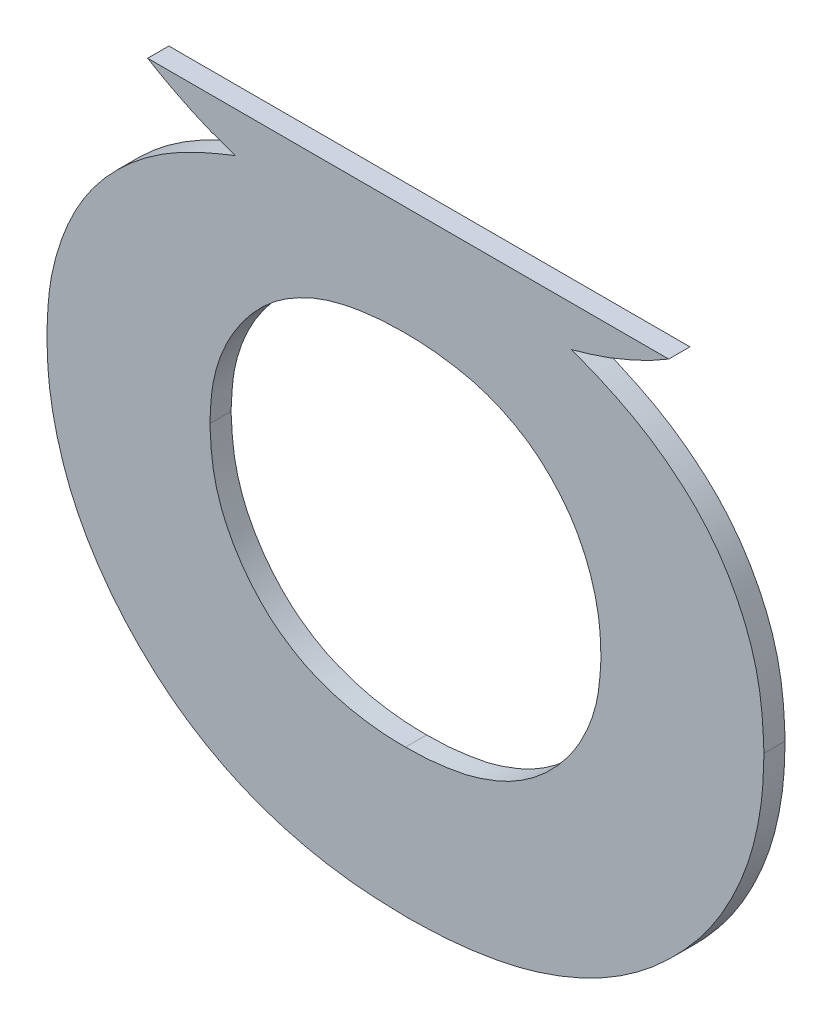
ISO-10303-21;
HEADER;
FILE_DESCRIPTION(('STEP AP214'),'2;1');
FILE_NAME('part.step','',(''),(''),'','','');
FILE_SCHEMA(('AUTOMOTIVE_DESIGN { 1 0 10303 214 1 1 1 1 }'));
ENDSEC;
DATA;
#1=APPLICATION_CONTEXT('core data for automotive mechanical design processes');
#2=APPLICATION_PROTOCOL_DEFINITION('international standard','automotive_design',2000,#1);
#3=PRODUCT_CONTEXT('',#1,'mechanical');
#4=PRODUCT('Part','Part','',(#3));
#5=PRODUCT_RELATED_PRODUCT_CATEGORY('part','',(#4));
#6=PRODUCT_DEFINITION_FORMATION('','',#4);
#7=PRODUCT_DEFINITION_CONTEXT('part definition',#1,'design');
#8=PRODUCT_DEFINITION('design','',#6,#7);
#9=PRODUCT_DEFINITION_SHAPE('','',#8);
#10=(LENGTH_UNIT() NAMED_UNIT(*) SI_UNIT(.MILLI.,.METRE.));
#11=(NAMED_UNIT(*) PLANE_ANGLE_UNIT() SI_UNIT($,.RADIAN.));
#12=(NAMED_UNIT(*) SI_UNIT($,.STERADIAN.) SOLID_ANGLE_UNIT());
#13=UNCERTAINTY_MEASURE_WITH_UNIT(LENGTH_MEASURE(1.E-05),#10,'distance_accuracy_value','');
#14=(GEOMETRIC_REPRESENTATION_CONTEXT(3) GLOBAL_UNCERTAINTY_ASSIGNED_CONTEXT((#13)) GLOBAL_UNIT_ASSIGNED_CONTEXT((#10,
#11,#12)) REPRESENTATION_CONTEXT('',''));
#15=CARTESIAN_POINT('',(0.,0.,0.));
#16=DIRECTION('',(0.,0.,1.));
#17=DIRECTION('',(1.,0.,0.));
#18=AXIS2_PLACEMENT_3D('',#15,#16,#17);
#19=CARTESIAN_POINT('',(-8.4615384615395,-7.33774038461538,0.5));
#20=CARTESIAN_POINT('',(-8.45049910584212,-7.00798334201043,0.5));
#21=CARTESIAN_POINT('',(-8.42885300590861,-6.3613918113376,0.5));
#22=CARTESIAN_POINT('',(-8.20988557211714,-5.42877117305945,0.5));
#23=CARTESIAN_POINT('',(-7.8655008079904,-4.56122101360292,0.5));
#24=CARTESIAN_POINT('',(-7.38005113331607,-3.76283143510587,0.5));
#25=CARTESIAN_POINT('',(-6.7427479601573,-3.04891273766611,0.5));
#26=CARTESIAN_POINT('',(-5.97257549572589,-2.41080431461783,0.5));
#27=CARTESIAN_POINT('',(-5.0490386410386,-1.8736283607361,0.5));
#28=CARTESIAN_POINT('',(-4.36890273799675,-1.59798785054026,0.5));
#29=CARTESIAN_POINT('',(-4.01442307692411,-1.45432692307692,0.5));
#30=B_SPLINE_CURVE_WITH_KNOTS('',3,(#19,#20,#21,#22,#23,#24,#25,#26,#27,#28,#29),.UNSPECIFIED.,
.F.,.F.,(4,1,1,1,1,1,1,1,4),(0.,0.124810317489397,0.24472955480108,0.360917336242945,
0.477471766605826,0.596906810690356,0.722033177176971,0.855126622924826,1.),.UNSPECIFIED.);
#31=DIRECTION('',(0.,0.,1.));
#32=VECTOR('',#31,1.);
#33=SURFACE_OF_LINEAR_EXTRUSION('',#30,#32);
#34=CARTESIAN_POINT('',(-8.4615384615395,-7.33774038461538,1.));
#35=CARTESIAN_POINT('',(-8.45049910584212,-7.00798334201043,1.));
#36=CARTESIAN_POINT('',(-8.42885300590861,-6.3613918113376,1.));
#37=CARTESIAN_POINT('',(-8.20988557211714,-5.42877117305945,1.));
#38=CARTESIAN_POINT('',(-7.8655008079904,-4.56122101360292,1.));
#39=CARTESIAN_POINT('',(-7.38005113331607,-3.76283143510587,1.));
#40=CARTESIAN_POINT('',(-6.7427479601573,-3.04891273766611,1.));
#41=CARTESIAN_POINT('',(-5.97257549572589,-2.41080431461783,1.));
#42=CARTESIAN_POINT('',(-5.0490386410386,-1.8736283607361,1.));
#43=CARTESIAN_POINT('',(-4.36890273799675,-1.59798785054026,1.));
#44=CARTESIAN_POINT('',(-4.01442307692411,-1.45432692307692,1.));
#45=B_SPLINE_CURVE_WITH_KNOTS('',3,(#34,#35,#36,#37,#38,#39,#40,#41,#42,#43,#44),.UNSPECIFIED.,
.F.,.F.,(4,1,1,1,1,1,1,1,4),(0.,0.124810317489397,0.24472955480108,0.360917336242945,
0.477471766605826,0.596906810690356,0.722033177176971,0.855126622924826,1.),.UNSPECIFIED.);
#46=CARTESIAN_POINT('',(-8.46153846153949,-7.33774038461538,1.));
#47=VERTEX_POINT('',#46);
#48=CARTESIAN_POINT('',(-4.01442307692411,-1.45432692307692,1.));
#49=VERTEX_POINT('',#48);
#50=EDGE_CURVE('E172',#47,#49,#45,.T.);
#51=ORIENTED_EDGE('',*,*,#50,.T.);
#52=DIRECTION('',(0.,0.,1.));
#53=VECTOR('',#52,1.);
#54=CARTESIAN_POINT('',(-4.01442307692411,-1.45432692307692,0.5));
#55=LINE('',#54,#53);
#56=CARTESIAN_POINT('',(-4.01442307692411,-1.45432692307692,0.5));
#57=VERTEX_POINT('',#56);
#58=EDGE_CURVE('E188',#57,#49,#55,.T.);
#59=ORIENTED_EDGE('',*,*,#58,.F.);
#60=CARTESIAN_POINT('',(-8.46153846153949,-7.33774038461538,0.5));
#61=VERTEX_POINT('',#60);
#62=EDGE_CURVE('E216',#61,#57,#30,.T.);
#63=ORIENTED_EDGE('',*,*,#62,.F.);
#64=DIRECTION('',(0.,0.,1.));
#65=VECTOR('',#64,1.);
#66=CARTESIAN_POINT('',(-8.46153846153949,-7.33774038461538,0.5));
#67=LINE('',#66,#65);
#68=EDGE_CURVE('E193',#61,#47,#67,.T.);
#69=ORIENTED_EDGE('',*,*,#68,.T.);
#70=EDGE_LOOP('',(#51,#59,#63,#69));
#71=FACE_BOUND('',#70,.T.);
#72=ADVANCED_FACE('F39',(#71),#33,.F.);
#73=CARTESIAN_POINT('',(0.0480769230758911,-15.,0.5));
#74=CARTESIAN_POINT('',(-0.264705034110985,-14.9929518472894,0.5));
#75=CARTESIAN_POINT('',(-0.87396899280413,-14.9792228411134,0.5));
#76=CARTESIAN_POINT('',(-1.76496345727024,-14.8758506679064,0.5));
#77=CARTESIAN_POINT('',(-2.610156155843,-14.7025924945436,0.5));
#78=CARTESIAN_POINT('',(-3.40904923958802,-14.4567826661013,0.5));
#79=CARTESIAN_POINT('',(-4.1629030638,-14.1425003409715,0.5));
#80=CARTESIAN_POINT('',(-4.86676089202795,-13.756204876487,0.5));
#81=CARTESIAN_POINT('',(-5.52788023392,-13.3042730139945,0.5));
#82=CARTESIAN_POINT('',(-6.12931972075297,-12.7812947267448,0.5));
#83=CARTESIAN_POINT('',(-6.67668183430174,-12.2135710105676,0.5));
#84=CARTESIAN_POINT('',(-7.15047668654475,-11.6051284872536,0.5));
#85=CARTESIAN_POINT('',(-7.55939574207248,-10.9696379750101,0.5));
#86=CARTESIAN_POINT('',(-7.89044083784901,-10.3026016582386,0.5));
#87=CARTESIAN_POINT('',(-8.14357712346885,-9.60202037783917,0.5));
#88=CARTESIAN_POINT('',(-8.33129403145595,-8.87634501730495,0.5));
#89=CARTESIAN_POINT('',(-8.4415622476441,-8.11636049014744,0.5));
#90=CARTESIAN_POINT('',(-8.45479664474449,-7.6005186133574,0.5));
#91=CARTESIAN_POINT('',(-8.46153846153949,-7.33774038461538,0.5));
#92=B_SPLINE_CURVE_WITH_KNOTS('',3,(#73,#74,#75,#76,#77,#78,#79,#80,#81,#82,#83,#84,#85,#86,#87,
#88,#89,#90,#91),.UNSPECIFIED.,.F.,.F.,(4,1,1,1,1,1,1,1,1,1,1,1,1,1,1,1,4),(0.,
0.0732022743681664,0.142589770420307,0.209629161205785,0.27488866995901,0.33793766999179,
0.400470189127103,0.462510283815205,0.525016427194348,0.586701110532973,0.646826279775098,
0.705230049972738,0.7633167342767,0.820723796113227,0.879292973818233,0.938509880713559,1.),.UNSPECIFIED.);
#93=DIRECTION('',(0.,0.,1.));
#94=VECTOR('',#93,1.);
#95=SURFACE_OF_LINEAR_EXTRUSION('',#92,#94);
#96=CARTESIAN_POINT('',(0.0480769230758911,-15.,1.));
#97=CARTESIAN_POINT('',(-0.264705034110985,-14.9929518472894,1.));
#98=CARTESIAN_POINT('',(-0.87396899280413,-14.9792228411134,1.));
#99=CARTESIAN_POINT('',(-1.76496345727024,-14.8758506679064,1.));
#100=CARTESIAN_POINT('',(-2.610156155843,-14.7025924945436,1.));
#101=CARTESIAN_POINT('',(-3.40904923958802,-14.4567826661013,1.));
#102=CARTESIAN_POINT('',(-4.1629030638,-14.1425003409715,1.));
#103=CARTESIAN_POINT('',(-4.86676089202795,-13.756204876487,1.));
#104=CARTESIAN_POINT('',(-5.52788023392,-13.3042730139945,1.));
#105=CARTESIAN_POINT('',(-6.12931972075297,-12.7812947267448,1.));
#106=CARTESIAN_POINT('',(-6.67668183430174,-12.2135710105676,1.));
#107=CARTESIAN_POINT('',(-7.15047668654475,-11.6051284872536,1.));
#108=CARTESIAN_POINT('',(-7.55939574207248,-10.9696379750101,1.));
#109=CARTESIAN_POINT('',(-7.89044083784901,-10.3026016582386,1.));
#110=CARTESIAN_POINT('',(-8.14357712346885,-9.60202037783917,1.));
#111=CARTESIAN_POINT('',(-8.33129403145595,-8.87634501730495,1.));
#112=CARTESIAN_POINT('',(-8.4415622476441,-8.11636049014744,1.));
#113=CARTESIAN_POINT('',(-8.45479664474449,-7.6005186133574,1.));
#114=CARTESIAN_POINT('',(-8.46153846153949,-7.33774038461538,1.));
#115=B_SPLINE_CURVE_WITH_KNOTS('',3,(#96,#97,#98,#99,#100,#101,#102,#103,#104,#105,#106,#107,
#108,#109,#110,#111,#112,#113,#114),.UNSPECIFIED.,.F.,.F.,(4,1,1,1,1,1,1,1,1,1,1,1,1,1,1,1,4),
(0.,0.0732022743681664,0.142589770420307,0.209629161205785,0.27488866995901,0.33793766999179,
0.400470189127103,0.462510283815205,0.525016427194348,0.586701110532973,0.646826279775098,
0.705230049972738,0.7633167342767,0.820723796113227,0.879292973818233,0.938509880713559,1.),.UNSPECIFIED.);
#116=CARTESIAN_POINT('',(0.0480769230758911,-15.,1.));
#117=VERTEX_POINT('',#116);
#118=EDGE_CURVE('E166',#117,#47,#115,.T.);
#119=ORIENTED_EDGE('',*,*,#118,.T.);
#120=ORIENTED_EDGE('',*,*,#68,.F.);
#121=CARTESIAN_POINT('',(0.0480769230758911,-15.,0.5));
#122=VERTEX_POINT('',#121);
#123=EDGE_CURVE('E225',#122,#61,#92,.T.);
#124=ORIENTED_EDGE('',*,*,#123,.F.);
#125=DIRECTION('',(0.,0.,1.));
#126=VECTOR('',#125,1.);
#127=CARTESIAN_POINT('',(0.0480769230758911,-15.,0.5));
#128=LINE('',#127,#126);
#129=EDGE_CURVE('E200',#122,#117,#128,.T.);
#130=ORIENTED_EDGE('',*,*,#129,.T.);
#131=EDGE_LOOP('',(#119,#120,#124,#130));
#132=FACE_BOUND('',#131,.T.);
#133=ADVANCED_FACE('F211',(#132),#95,.F.);
#134=CARTESIAN_POINT('',(8.46153846153743,-7.43389423076923,0.5));
#135=CARTESIAN_POINT('',(8.45494912118454,-7.69671314647124,0.5));
#136=CARTESIAN_POINT('',(8.44201404010604,-8.21263489303553,0.5));
#137=CARTESIAN_POINT('',(8.32992964254397,-8.96962658936312,0.5));
#138=CARTESIAN_POINT('',(8.1516374204105,-9.69332438819784,0.5));
#139=CARTESIAN_POINT('',(7.8952318290189,-10.3855244074159,0.5));
#140=CARTESIAN_POINT('',(7.57076509426886,-11.0457738515821,0.5));
#141=CARTESIAN_POINT('',(7.17706260191002,-11.678283518099,0.5));
#142=CARTESIAN_POINT('',(6.7061086663017,-12.2735212781482,0.5));
#143=CARTESIAN_POINT('',(6.16580270339293,-12.8278457921271,0.5));
#144=CARTESIAN_POINT('',(5.57354475830978,-13.3418492888072,0.5));
#145=CARTESIAN_POINT('',(4.92343231152188,-13.7855482273581,0.5));
#146=CARTESIAN_POINT('',(4.22602203066115,-14.1610870335744,0.5));
#147=CARTESIAN_POINT('',(3.48267993624245,-14.4676305726067,0.5));
#148=CARTESIAN_POINT('',(2.6924222984907,-14.7099855755892,0.5));
#149=CARTESIAN_POINT('',(1.85245088194766,-14.8745791061218,0.5));
#150=CARTESIAN_POINT('',(0.966187200698521,-14.9793971179639,0.5));
#151=CARTESIAN_POINT('',(0.358880009039261,-14.9930254137519,0.5));
#152=CARTESIAN_POINT('',(0.0480769230758911,-15.,0.5));
#153=B_SPLINE_CURVE_WITH_KNOTS('',3,(#134,#135,#136,#137,#138,#139,#140,#141,#142,#143,#144,
#145,#146,#147,#148,#149,#150,#151,#152),.UNSPECIFIED.,.F.,.F.,(4,1,1,1,1,1,1,1,1,1,1,1,1,1,1,1,
4),(0.,0.0621412514191654,0.121985218911016,0.180598949625262,0.238169028977797,
0.296236214841668,0.35435171836427,0.414075494499011,0.475401981943904,0.537233507780417,
0.599271689150578,0.661181245030053,0.724278144243681,0.789183665345461,0.85637382732121,
0.92649608253162,1.),.UNSPECIFIED.);
#154=DIRECTION('',(0.,0.,1.));
#155=VECTOR('',#154,1.);
#156=SURFACE_OF_LINEAR_EXTRUSION('',#153,#155);
#157=CARTESIAN_POINT('',(8.46153846153743,-7.43389423076923,1.));
#158=CARTESIAN_POINT('',(8.45494912118454,-7.69671314647124,1.));
#159=CARTESIAN_POINT('',(8.44201404010604,-8.21263489303553,1.));
#160=CARTESIAN_POINT('',(8.32992964254397,-8.96962658936312,1.));
#161=CARTESIAN_POINT('',(8.1516374204105,-9.69332438819784,1.));
#162=CARTESIAN_POINT('',(7.8952318290189,-10.3855244074159,1.));
#163=CARTESIAN_POINT('',(7.57076509426886,-11.0457738515821,1.));
#164=CARTESIAN_POINT('',(7.17706260191002,-11.678283518099,1.));
#165=CARTESIAN_POINT('',(6.7061086663017,-12.2735212781482,1.));
#166=CARTESIAN_POINT('',(6.16580270339293,-12.8278457921271,1.));
#167=CARTESIAN_POINT('',(5.57354475830978,-13.3418492888072,1.));
#168=CARTESIAN_POINT('',(4.92343231152188,-13.7855482273581,1.));
#169=CARTESIAN_POINT('',(4.22602203066115,-14.1610870335744,1.));
#170=CARTESIAN_POINT('',(3.48267993624245,-14.4676305726067,1.));
#171=CARTESIAN_POINT('',(2.6924222984907,-14.7099855755892,1.));
#172=CARTESIAN_POINT('',(1.85245088194766,-14.8745791061218,1.));
#173=CARTESIAN_POINT('',(0.966187200698521,-14.9793971179639,1.));
#174=CARTESIAN_POINT('',(0.358880009039261,-14.9930254137519,1.));
#175=CARTESIAN_POINT('',(0.0480769230758911,-15.,1.));
#176=B_SPLINE_CURVE_WITH_KNOTS('',3,(#157,#158,#159,#160,#161,#162,#163,#164,#165,#166,#167,
#168,#169,#170,#171,#172,#173,#174,#175),.UNSPECIFIED.,.F.,.F.,(4,1,1,1,1,1,1,1,1,1,1,1,1,1,1,1,
4),(0.,0.0621412514191654,0.121985218911016,0.180598949625262,0.238169028977797,
0.296236214841668,0.35435171836427,0.414075494499011,0.475401981943904,0.537233507780417,
0.599271689150578,0.661181245030053,0.724278144243681,0.789183665345461,0.85637382732121,
0.92649608253162,1.),.UNSPECIFIED.);
#177=CARTESIAN_POINT('',(8.46153846153743,-7.43389423076923,1.));
#178=VERTEX_POINT('',#177);
#179=EDGE_CURVE('E143',#178,#117,#176,.T.);
#180=ORIENTED_EDGE('',*,*,#179,.T.);
#181=ORIENTED_EDGE('',*,*,#129,.F.);
#182=CARTESIAN_POINT('',(8.46153846153743,-7.43389423076923,0.5));
#183=VERTEX_POINT('',#182);
#184=EDGE_CURVE('E207',#183,#122,#153,.T.);
#185=ORIENTED_EDGE('',*,*,#184,.F.);
#186=DIRECTION('',(0.,0.,1.));
#187=VECTOR('',#186,1.);
#188=CARTESIAN_POINT('',(8.46153846153743,-7.43389423076923,0.5));
#189=LINE('',#188,#187);
#190=EDGE_CURVE('E48',#183,#178,#189,.T.);
#191=ORIENTED_EDGE('',*,*,#190,.T.);
#192=EDGE_LOOP('',(#180,#181,#185,#191));
#193=FACE_BOUND('',#192,.T.);
#194=ADVANCED_FACE('F204',(#193),#156,.F.);
#195=CARTESIAN_POINT('',(3.9182692307682,-1.45432692307692,0.5));
#196=CARTESIAN_POINT('',(4.10562086443235,-1.52389080141126,0.5));
#197=CARTESIAN_POINT('',(4.47286624892474,-1.66024943755463,0.5));
#198=CARTESIAN_POINT('',(4.99455707991873,-1.90378779625626,0.5));
#199=CARTESIAN_POINT('',(5.4835840101317,-2.15867826249266,0.5));
#200=CARTESIAN_POINT('',(5.93099911755685,-2.44334662321693,0.5));
#201=CARTESIAN_POINT('',(6.33935235341967,-2.7504860990177,0.5));
#202=CARTESIAN_POINT('',(6.71541105148635,-3.0753918062858,0.5));
#203=CARTESIAN_POINT('',(7.05163806481294,-3.42307779075004,0.5));
#204=CARTESIAN_POINT('',(7.44672390162454,-3.91506971948227,0.5));
#205=CARTESIAN_POINT('',(7.85257359684506,-4.58819142866356,0.5));
#206=CARTESIAN_POINT('',(8.21499952426071,-5.4677516622261,0.5));
#207=CARTESIAN_POINT('',(8.41977468940996,-6.4290233565029,0.5));
#208=CARTESIAN_POINT('',(8.4473456094167,-7.09240247865067,0.5));
#209=CARTESIAN_POINT('',(8.46153846153743,-7.43389423076923,0.5));
#210=B_SPLINE_CURVE_WITH_KNOTS('',3,(#195,#196,#197,#198,#199,#200,#201,#202,#203,#204,#205,
#206,#207,#208,#209),.UNSPECIFIED.,.F.,.F.,(4,1,1,1,1,1,1,1,1,1,1,1,4),(0.,0.0741852340541935,
0.145417385859193,0.213637599541877,0.278851025070236,0.34208260060319,0.403245550801459,
0.463220757834126,0.521425951704432,0.637269259250794,0.75372242308715,0.873222176520734,1.),.UNSPECIFIED.);
#211=DIRECTION('',(0.,0.,1.));
#212=VECTOR('',#211,1.);
#213=SURFACE_OF_LINEAR_EXTRUSION('',#210,#212);
#214=CARTESIAN_POINT('',(3.9182692307682,-1.45432692307692,1.));
#215=CARTESIAN_POINT('',(4.10562086443235,-1.52389080141126,1.));
#216=CARTESIAN_POINT('',(4.47286624892474,-1.66024943755463,1.));
#217=CARTESIAN_POINT('',(4.99455707991873,-1.90378779625626,1.));
#218=CARTESIAN_POINT('',(5.4835840101317,-2.15867826249266,1.));
#219=CARTESIAN_POINT('',(5.93099911755685,-2.44334662321693,1.));
#220=CARTESIAN_POINT('',(6.33935235341967,-2.7504860990177,1.));
#221=CARTESIAN_POINT('',(6.71541105148635,-3.0753918062858,1.));
#222=CARTESIAN_POINT('',(7.05163806481294,-3.42307779075004,1.));
#223=CARTESIAN_POINT('',(7.44672390162454,-3.91506971948227,1.));
#224=CARTESIAN_POINT('',(7.85257359684506,-4.58819142866356,1.));
#225=CARTESIAN_POINT('',(8.21499952426071,-5.4677516622261,1.));
#226=CARTESIAN_POINT('',(8.41977468940996,-6.4290233565029,1.));
#227=CARTESIAN_POINT('',(8.4473456094167,-7.09240247865067,1.));
#228=CARTESIAN_POINT('',(8.46153846153743,-7.43389423076923,1.));
#229=B_SPLINE_CURVE_WITH_KNOTS('',3,(#214,#215,#216,#217,#218,#219,#220,#221,#222,#223,#224,
#225,#226,#227,#228),.UNSPECIFIED.,.F.,.F.,(4,1,1,1,1,1,1,1,1,1,1,1,4),(0.,0.0741852340541935,
0.145417385859193,0.213637599541877,0.278851025070236,0.34208260060319,0.403245550801459,
0.463220757834126,0.521425951704432,0.637269259250794,0.75372242308715,0.873222176520734,1.),.UNSPECIFIED.);
#230=CARTESIAN_POINT('',(3.9182692307682,-1.45432692307692,1.));
#231=VERTEX_POINT('',#230);
#232=EDGE_CURVE('E141',#231,#178,#229,.T.);
#233=ORIENTED_EDGE('',*,*,#232,.T.);
#234=ORIENTED_EDGE('',*,*,#190,.F.);
#235=CARTESIAN_POINT('',(3.9182692307682,-1.45432692307692,0.5));
#236=VERTEX_POINT('',#235);
#237=EDGE_CURVE('E246',#236,#183,#210,.T.);
#238=ORIENTED_EDGE('',*,*,#237,.F.);
#239=DIRECTION('',(0.,0.,1.));
#240=VECTOR('',#239,1.);
#241=CARTESIAN_POINT('',(3.9182692307682,-1.45432692307692,0.5));
#242=LINE('',#241,#240);
#243=EDGE_CURVE('E11',#236,#231,#242,.T.);
#244=ORIENTED_EDGE('',*,*,#243,.T.);
#245=EDGE_LOOP('',(#233,#234,#238,#244));
#246=FACE_BOUND('',#245,.T.);
#247=ADVANCED_FACE('F245',(#246),#213,.F.);
#248=CARTESIAN_POINT('',(-0.0360576923087233,-3.07692307692307,0.5));
#249=CARTESIAN_POINT('',(-0.214566291078873,-3.07947941285192,0.5));
#250=CARTESIAN_POINT('',(-0.562648284084637,-3.08446412793587,0.5));
#251=CARTESIAN_POINT('',(-1.06623918994541,-3.14913857440475,0.5));
#252=CARTESIAN_POINT('',(-1.54186192422878,-3.23616227367952,0.5));
#253=CARTESIAN_POINT('',(-1.98623947823518,-3.3664234194852,0.5));
#254=CARTESIAN_POINT('',(-2.39485707660215,-3.54311504298395,0.5));
#255=CARTESIAN_POINT('',(-2.77530993721546,-3.7491763185584,0.5));
#256=CARTESIAN_POINT('',(-3.12307688521098,-3.99443064819808,0.5));
#257=CARTESIAN_POINT('',(-3.53518992373988,-4.36936111640245,0.5));
#258=CARTESIAN_POINT('',(-3.96539927913374,-4.90099700001163,0.5));
#259=CARTESIAN_POINT('',(-4.34649631165488,-5.61564248939459,0.5));
#260=CARTESIAN_POINT('',(-4.57878881211868,-6.40406489153468,0.5));
#261=CARTESIAN_POINT('',(-4.60297185307783,-6.95354017890907,0.5));
#262=CARTESIAN_POINT('',(-4.61538461538565,-7.23557692307692,0.5));
#263=B_SPLINE_CURVE_WITH_KNOTS('',3,(#248,#249,#250,#251,#252,#253,#254,#255,#256,#257,#258,
#259,#260,#261,#262),.UNSPECIFIED.,.F.,.F.,(4,1,1,1,1,1,1,1,1,1,1,1,4),(0.,0.0768540903502659,
0.149861267883298,0.218411772587832,0.285039273331834,0.348839978091303,0.409866047002369,
0.471166118099545,0.531658930365375,0.649462955770373,0.763739871194076,0.878731511614468,1.),.UNSPECIFIED.);
#264=DIRECTION('',(0.,0.,1.));
#265=VECTOR('',#264,1.);
#266=SURFACE_OF_LINEAR_EXTRUSION('',#263,#265);
#267=CARTESIAN_POINT('',(-0.0360576923087233,-3.07692307692307,1.));
#268=CARTESIAN_POINT('',(-0.214566291078873,-3.07947941285192,1.));
#269=CARTESIAN_POINT('',(-0.562648284084637,-3.08446412793587,1.));
#270=CARTESIAN_POINT('',(-1.06623918994541,-3.14913857440475,1.));
#271=CARTESIAN_POINT('',(-1.54186192422878,-3.23616227367952,1.));
#272=CARTESIAN_POINT('',(-1.98623947823518,-3.3664234194852,1.));
#273=CARTESIAN_POINT('',(-2.39485707660215,-3.54311504298395,1.));
#274=CARTESIAN_POINT('',(-2.77530993721546,-3.7491763185584,1.));
#275=CARTESIAN_POINT('',(-3.12307688521098,-3.99443064819808,1.));
#276=CARTESIAN_POINT('',(-3.53518992373988,-4.36936111640245,1.));
#277=CARTESIAN_POINT('',(-3.96539927913374,-4.90099700001163,1.));
#278=CARTESIAN_POINT('',(-4.34649631165488,-5.61564248939459,1.));
#279=CARTESIAN_POINT('',(-4.57878881211868,-6.40406489153468,1.));
#280=CARTESIAN_POINT('',(-4.60297185307783,-6.95354017890907,1.));
#281=CARTESIAN_POINT('',(-4.61538461538565,-7.23557692307692,1.));
#282=B_SPLINE_CURVE_WITH_KNOTS('',3,(#267,#268,#269,#270,#271,#272,#273,#274,#275,#276,#277,
#278,#279,#280,#281),.UNSPECIFIED.,.F.,.F.,(4,1,1,1,1,1,1,1,1,1,1,1,4),(0.,0.0768540903502659,
0.149861267883298,0.218411772587832,0.285039273331834,0.348839978091303,0.409866047002369,
0.471166118099545,0.531658930365375,0.649462955770373,0.763739871194076,0.878731511614468,1.),.UNSPECIFIED.);
#283=CARTESIAN_POINT('',(-0.0360576923087233,-3.07692307692307,1.));
#284=VERTEX_POINT('',#283);
#285=CARTESIAN_POINT('',(-4.61538461538565,-7.23557692307692,1.));
#286=VERTEX_POINT('',#285);
#287=EDGE_CURVE('E277',#284,#286,#282,.T.);
#288=ORIENTED_EDGE('',*,*,#287,.T.);
#289=DIRECTION('',(0.,0.,1.));
#290=VECTOR('',#289,1.);
#291=CARTESIAN_POINT('',(-4.61538461538565,-7.23557692307692,0.5));
#292=LINE('',#291,#290);
#293=CARTESIAN_POINT('',(-4.61538461538565,-7.23557692307692,0.5));
#294=VERTEX_POINT('',#293);
#295=EDGE_CURVE('E147',#294,#286,#292,.T.);
#296=ORIENTED_EDGE('',*,*,#295,.F.);
#297=CARTESIAN_POINT('',(-0.0360576923087233,-3.07692307692307,0.5));
#298=VERTEX_POINT('',#297);
#299=EDGE_CURVE('E65',#298,#294,#263,.T.);
#300=ORIENTED_EDGE('',*,*,#299,.F.);
#301=DIRECTION('',(0.,0.,1.));
#302=VECTOR('',#301,1.);
#303=CARTESIAN_POINT('',(-0.0360576923087233,-3.07692307692307,0.5));
#304=LINE('',#303,#302);
#305=EDGE_CURVE('E268',#298,#284,#304,.T.);
#306=ORIENTED_EDGE('',*,*,#305,.T.);
#307=EDGE_LOOP('',(#288,#296,#300,#306));
#308=FACE_BOUND('',#307,.T.);
#309=ADVANCED_FACE('F322',(#308),#266,.F.);
#310=CARTESIAN_POINT('',(4.61538461538358,-7.41586538461538,0.5));
#311=CARTESIAN_POINT('',(4.61192410307699,-7.2594877457363,0.5));
#312=CARTESIAN_POINT('',(4.60515879209887,-6.95376903610369,0.5));
#313=CARTESIAN_POINT('',(4.55222888329481,-6.50635061623262,0.5));
#314=CARTESIAN_POINT('',(4.45359467680917,-6.08262114215294,0.5));
#315=CARTESIAN_POINT('',(4.32313361222387,-5.67929785924586,0.5));
#316=CARTESIAN_POINT('',(4.15201789798367,-5.29776668264454,0.5));
#317=CARTESIAN_POINT('',(3.94932962846542,-4.93436206318015,0.5));
#318=CARTESIAN_POINT('',(3.70031513758018,-4.59786338708637,0.5));
#319=CARTESIAN_POINT('',(3.41824594173068,-4.28619462658902,0.5));
#320=CARTESIAN_POINT('',(3.10515763528438,-4.00026078830154,0.5));
#321=CARTESIAN_POINT('',(2.75351454896203,-3.75280884212384,0.5));
#322=CARTESIAN_POINT('',(2.3674619040964,-3.54353925346137,0.5));
#323=CARTESIAN_POINT('',(1.95159708654766,-3.36789307160604,0.5));
#324=CARTESIAN_POINT('',(1.50222243920194,-3.23426491332785,0.5));
#325=CARTESIAN_POINT('',(1.01799260121268,-3.14955244066041,0.5));
#326=CARTESIAN_POINT('',(0.502539270978463,-3.08438074134605,0.5));
#327=CARTESIAN_POINT('',(0.146461503111343,-3.07945032271719,0.5));
#328=CARTESIAN_POINT('',(-0.0360576923087233,-3.07692307692307,0.5));
#329=B_SPLINE_CURVE_WITH_KNOTS('',3,(#310,#311,#312,#313,#314,#315,#316,#317,#318,#319,#320,
#321,#322,#323,#324,#325,#326,#327,#328),.UNSPECIFIED.,.F.,.F.,(4,1,1,1,1,1,1,1,1,1,1,1,1,1,1,1,
4),(0.,0.0651856228079491,0.127438070009828,0.187402358454847,0.246292888043986,
0.303866057361529,0.361457393338262,0.419416883076593,0.477951072990859,0.536485262905126,
0.595800574410109,0.656716782238851,0.719220778090318,0.783691028951267,0.851662891659349,
0.923965009589201,1.),.UNSPECIFIED.);
#330=DIRECTION('',(0.,0.,1.));
#331=VECTOR('',#330,1.);
#332=SURFACE_OF_LINEAR_EXTRUSION('',#329,#331);
#333=CARTESIAN_POINT('',(4.61538461538358,-7.41586538461538,1.));
#334=CARTESIAN_POINT('',(4.61192410307699,-7.2594877457363,1.));
#335=CARTESIAN_POINT('',(4.60515879209887,-6.95376903610369,1.));
#336=CARTESIAN_POINT('',(4.55222888329481,-6.50635061623262,1.));
#337=CARTESIAN_POINT('',(4.45359467680917,-6.08262114215294,1.));
#338=CARTESIAN_POINT('',(4.32313361222387,-5.67929785924586,1.));
#339=CARTESIAN_POINT('',(4.15201789798367,-5.29776668264454,1.));
#340=CARTESIAN_POINT('',(3.94932962846542,-4.93436206318015,1.));
#341=CARTESIAN_POINT('',(3.70031513758018,-4.59786338708637,1.));
#342=CARTESIAN_POINT('',(3.41824594173068,-4.28619462658902,1.));
#343=CARTESIAN_POINT('',(3.10515763528438,-4.00026078830154,1.));
#344=CARTESIAN_POINT('',(2.75351454896203,-3.75280884212384,1.));
#345=CARTESIAN_POINT('',(2.3674619040964,-3.54353925346137,1.));
#346=CARTESIAN_POINT('',(1.95159708654766,-3.36789307160604,1.));
#347=CARTESIAN_POINT('',(1.50222243920194,-3.23426491332785,1.));
#348=CARTESIAN_POINT('',(1.01799260121268,-3.14955244066041,1.));
#349=CARTESIAN_POINT('',(0.502539270978463,-3.08438074134605,1.));
#350=CARTESIAN_POINT('',(0.146461503111343,-3.07945032271719,1.));
#351=CARTESIAN_POINT('',(-0.0360576923087233,-3.07692307692307,1.));
#352=B_SPLINE_CURVE_WITH_KNOTS('',3,(#333,#334,#335,#336,#337,#338,#339,#340,#341,#342,#343,
#344,#345,#346,#347,#348,#349,#350,#351),.UNSPECIFIED.,.F.,.F.,(4,1,1,1,1,1,1,1,1,1,1,1,1,1,1,1,
4),(0.,0.0651856228079491,0.127438070009828,0.187402358454847,0.246292888043986,
0.303866057361529,0.361457393338262,0.419416883076593,0.477951072990859,0.536485262905126,
0.595800574410109,0.656716782238851,0.719220778090318,0.783691028951267,0.851662891659349,
0.923965009589201,1.),.UNSPECIFIED.);
#353=CARTESIAN_POINT('',(4.61538461538358,-7.41586538461538,1.));
#354=VERTEX_POINT('',#353);
#355=EDGE_CURVE('E287',#354,#284,#352,.T.);
#356=ORIENTED_EDGE('',*,*,#355,.T.);
#357=ORIENTED_EDGE('',*,*,#305,.F.);
#358=CARTESIAN_POINT('',(4.61538461538358,-7.41586538461538,0.5));
#359=VERTEX_POINT('',#358);
#360=EDGE_CURVE('E334',#359,#298,#329,.T.);
#361=ORIENTED_EDGE('',*,*,#360,.F.);
#362=DIRECTION('',(0.,0.,1.));
#363=VECTOR('',#362,1.);
#364=CARTESIAN_POINT('',(4.61538461538358,-7.41586538461538,0.5));
#365=LINE('',#364,#363);
#366=EDGE_CURVE('E265',#359,#354,#365,.T.);
#367=ORIENTED_EDGE('',*,*,#366,.T.);
#368=EDGE_LOOP('',(#356,#357,#361,#367));
#369=FACE_BOUND('',#368,.T.);
#370=ADVANCED_FACE('F327',(#369),#332,.F.);
#371=CARTESIAN_POINT('',(-1.0321604682062E-12,-11.5384615384615,0.5));
#372=CARTESIAN_POINT('',(0.176550273325573,-11.5360690548591,0.5));
#373=CARTESIAN_POINT('',(0.520726408004594,-11.5314050249313,0.5));
#374=CARTESIAN_POINT('',(1.02164400899667,-11.4639980527028,0.5));
#375=CARTESIAN_POINT('',(1.49777987231119,-11.3838145958029,0.5));
#376=CARTESIAN_POINT('',(1.93697184205611,-11.2379975156929,0.5));
#377=CARTESIAN_POINT('',(2.35127832960521,-11.0739568220841,0.5));
#378=CARTESIAN_POINT('',(2.73046328447714,-10.8604992783198,0.5));
#379=CARTESIAN_POINT('',(3.08181302011753,-10.613702998477,0.5));
#380=CARTESIAN_POINT('',(3.50111021468963,-10.2390517461464,0.5));
#381=CARTESIAN_POINT('',(3.94631473975934,-9.71378473222701,0.5));
#382=CARTESIAN_POINT('',(4.33243459765112,-9.00176943560328,0.5));
#383=CARTESIAN_POINT('',(4.57198879211757,-8.2282615565634,0.5));
#384=CARTESIAN_POINT('',(4.60074017314722,-7.69001823891664,0.5));
#385=CARTESIAN_POINT('',(4.61538461538358,-7.41586538461538,0.5));
#386=B_SPLINE_CURVE_WITH_KNOTS('',3,(#371,#372,#373,#374,#375,#376,#377,#378,#379,#380,#381,
#382,#383,#384,#385),.UNSPECIFIED.,.F.,.F.,(4,1,1,1,1,1,1,1,1,1,1,1,4),(0.,0.0762536929113241,
0.148652849903381,0.21829045697982,0.284573230522107,0.348259283030438,0.410672556582859,
0.472184092937486,0.533530808722805,0.653395077053161,0.767712488651533,0.881684951458124,1.),.UNSPECIFIED.);
#387=DIRECTION('',(0.,0.,1.));
#388=VECTOR('',#387,1.);
#389=SURFACE_OF_LINEAR_EXTRUSION('',#386,#388);
#390=CARTESIAN_POINT('',(-1.0321604682062E-12,-11.5384615384615,1.));
#391=CARTESIAN_POINT('',(0.176550273325573,-11.5360690548591,1.));
#392=CARTESIAN_POINT('',(0.520726408004594,-11.5314050249313,1.));
#393=CARTESIAN_POINT('',(1.02164400899667,-11.4639980527028,1.));
#394=CARTESIAN_POINT('',(1.49777987231119,-11.3838145958029,1.));
#395=CARTESIAN_POINT('',(1.93697184205611,-11.2379975156929,1.));
#396=CARTESIAN_POINT('',(2.35127832960521,-11.0739568220841,1.));
#397=CARTESIAN_POINT('',(2.73046328447714,-10.8604992783198,1.));
#398=CARTESIAN_POINT('',(3.08181302011753,-10.613702998477,1.));
#399=CARTESIAN_POINT('',(3.50111021468963,-10.2390517461464,1.));
#400=CARTESIAN_POINT('',(3.94631473975934,-9.71378473222701,1.));
#401=CARTESIAN_POINT('',(4.33243459765112,-9.00176943560328,1.));
#402=CARTESIAN_POINT('',(4.57198879211757,-8.2282615565634,1.));
#403=CARTESIAN_POINT('',(4.60074017314722,-7.69001823891664,1.));
#404=CARTESIAN_POINT('',(4.61538461538358,-7.41586538461538,1.));
#405=B_SPLINE_CURVE_WITH_KNOTS('',3,(#390,#391,#392,#393,#394,#395,#396,#397,#398,#399,#400,
#401,#402,#403,#404),.UNSPECIFIED.,.F.,.F.,(4,1,1,1,1,1,1,1,1,1,1,1,4),(0.,0.0762536929113241,
0.148652849903381,0.21829045697982,0.284573230522107,0.348259283030438,0.410672556582859,
0.472184092937486,0.533530808722805,0.653395077053161,0.767712488651533,0.881684951458124,1.),.UNSPECIFIED.);
#406=CARTESIAN_POINT('',(-1.0321604682062E-12,-11.5384615384615,1.));
#407=VERTEX_POINT('',#406);
#408=EDGE_CURVE('E140',#407,#354,#405,.T.);
#409=ORIENTED_EDGE('',*,*,#408,.T.);
#410=ORIENTED_EDGE('',*,*,#366,.F.);
#411=CARTESIAN_POINT('',(-1.0321604682062E-12,-11.5384615384615,0.5));
#412=VERTEX_POINT('',#411);
#413=EDGE_CURVE('E280',#412,#359,#386,.T.);
#414=ORIENTED_EDGE('',*,*,#413,.F.);
#415=DIRECTION('',(0.,0.,1.));
#416=VECTOR('',#415,1.);
#417=CARTESIAN_POINT('',(-1.0321604682062E-12,-11.5384615384615,0.5));
#418=LINE('',#417,#416);
#419=EDGE_CURVE('E145',#412,#407,#418,.T.);
#420=ORIENTED_EDGE('',*,*,#419,.T.);
#421=EDGE_LOOP('',(#409,#410,#414,#420));
#422=FACE_BOUND('',#421,.T.);
#423=ADVANCED_FACE('F321',(#422),#389,.F.);
#424=CARTESIAN_POINT('',(-4.61538461538565,-7.23557692307692,0.5));
#425=CARTESIAN_POINT('',(-4.60053363040832,-7.52751188250479,0.5));
#426=CARTESIAN_POINT('',(-4.57147409874071,-8.09875299623058,0.5));
#427=CARTESIAN_POINT('',(-4.33814233988481,-8.9194836247719,0.5));
#428=CARTESIAN_POINT('',(-3.94107049835292,-9.66153479071046,0.5));
#429=CARTESIAN_POINT('',(-3.49835338356644,-10.2108210779702,0.5));
#430=CARTESIAN_POINT('',(-3.07534575939922,-10.5975136579042,0.5));
#431=CARTESIAN_POINT('',(-2.71920926032791,-10.8461506488975,0.5));
#432=CARTESIAN_POINT('',(-2.34106187070333,-11.0690594791242,0.5));
#433=CARTESIAN_POINT('',(-1.92480900591448,-11.2321081403141,0.500000000000001));
#434=CARTESIAN_POINT('',(-1.4868806450653,-11.3751468651236,0.5));
#435=CARTESIAN_POINT('',(-1.01651067650587,-11.4662788371292,0.5));
#436=CARTESIAN_POINT('',(-0.51863504481922,-11.5310410367154,0.5));
#437=CARTESIAN_POINT('',(-0.176515951082078,-11.5359359919596,0.5));
#438=CARTESIAN_POINT('',(-1.0321604682062E-12,-11.5384615384615,0.5));
#439=B_SPLINE_CURVE_WITH_KNOTS('',3,(#424,#425,#426,#427,#428,#429,#430,#431,#432,#433,#434,
#435,#436,#437,#438),.UNSPECIFIED.,.F.,.F.,(4,1,1,1,1,1,1,1,1,1,1,1,4),(0.,0.123364656543765,
0.241392685331583,0.357386362752994,0.47728856829016,0.537881530632936,0.599251659500744,
0.660738683958037,0.723055123290192,0.787912439351266,0.855385268084249,0.925386196176317,1.),.UNSPECIFIED.);
#440=DIRECTION('',(0.,0.,1.));
#441=VECTOR('',#440,1.);
#442=SURFACE_OF_LINEAR_EXTRUSION('',#439,#441);
#443=CARTESIAN_POINT('',(-4.61538461538565,-7.23557692307692,1.));
#444=CARTESIAN_POINT('',(-4.60053363040832,-7.52751188250479,1.));
#445=CARTESIAN_POINT('',(-4.57147409874071,-8.09875299623058,1.));
#446=CARTESIAN_POINT('',(-4.33814233988481,-8.9194836247719,1.));
#447=CARTESIAN_POINT('',(-3.94107049835292,-9.66153479071046,1.));
#448=CARTESIAN_POINT('',(-3.49835338356644,-10.2108210779702,1.));
#449=CARTESIAN_POINT('',(-3.07534575939922,-10.5975136579042,1.));
#450=CARTESIAN_POINT('',(-2.71920926032791,-10.8461506488975,1.));
#451=CARTESIAN_POINT('',(-2.34106187070333,-11.0690594791242,1.));
#452=CARTESIAN_POINT('',(-1.92480900591448,-11.2321081403141,1.));
#453=CARTESIAN_POINT('',(-1.4868806450653,-11.3751468651236,1.));
#454=CARTESIAN_POINT('',(-1.01651067650587,-11.4662788371292,1.));
#455=CARTESIAN_POINT('',(-0.51863504481922,-11.5310410367154,1.));
#456=CARTESIAN_POINT('',(-0.176515951082078,-11.5359359919596,1.));
#457=CARTESIAN_POINT('',(-1.0321604682062E-12,-11.5384615384615,1.));
#458=B_SPLINE_CURVE_WITH_KNOTS('',3,(#443,#444,#445,#446,#447,#448,#449,#450,#451,#452,#453,
#454,#455,#456,#457),.UNSPECIFIED.,.F.,.F.,(4,1,1,1,1,1,1,1,1,1,1,1,4),(0.,0.123364656543765,
0.241392685331583,0.357386362752994,0.47728856829016,0.537881530632936,0.599251659500744,
0.660738683958037,0.723055123290192,0.787912439351266,0.855385268084249,0.925386196176317,1.),.UNSPECIFIED.);
#459=EDGE_CURVE('E275',#286,#407,#458,.T.);
#460=ORIENTED_EDGE('',*,*,#459,.T.);
#461=ORIENTED_EDGE('',*,*,#419,.F.);
#462=EDGE_CURVE('E267',#294,#412,#439,.T.);
#463=ORIENTED_EDGE('',*,*,#462,.F.);
#464=ORIENTED_EDGE('',*,*,#295,.T.);
#465=EDGE_LOOP('',(#460,#461,#463,#464));
#466=FACE_BOUND('',#465,.T.);
#467=ADVANCED_FACE('F316',(#466),#442,.F.);
#468=CARTESIAN_POINT('',(8.17034628619698,1.29686234703217,0.5));
#469=DIRECTION('',(0.,0.,1.));
#470=DIRECTION('',(1.,0.,0.));
#471=AXIS2_PLACEMENT_3D('',#468,#469,#470);
#472=PLANE('',#471);
#473=ORIENTED_EDGE('',*,*,#462,.T.);
#474=ORIENTED_EDGE('',*,*,#413,.T.);
#475=ORIENTED_EDGE('',*,*,#360,.T.);
#476=ORIENTED_EDGE('',*,*,#299,.T.);
#477=EDGE_LOOP('',(#473,#474,#475,#476));
#478=FACE_BOUND('',#477,.T.);
#479=CARTESIAN_POINT('',(-4.01442307692411,-1.45432692307692,0.5));
#480=CARTESIAN_POINT('',(-4.2384100614784,-1.37833581974484,0.5));
#481=CARTESIAN_POINT('',(-4.67732737328905,-1.22942622634853,0.5));
#482=CARTESIAN_POINT('',(-5.2974445910434,-0.939287095441448,0.5));
#483=CARTESIAN_POINT('',(-5.88122603721866,-0.629518404450236,0.5));
#484=CARTESIAN_POINT('',(-6.4281622173243,-0.285334654211238,0.5));
#485=CARTESIAN_POINT('',(-6.93039594279223,0.0974191148321559,0.5));
#486=CARTESIAN_POINT('',(-7.39139229300922,0.516962040217205,0.5));
#487=CARTESIAN_POINT('',(-7.81400813592672,0.967226277300414,0.5));
#488=CARTESIAN_POINT('',(-8.19167085803701,1.45566899472176,0.5));
#489=CARTESIAN_POINT('',(-8.5293071551274,1.97121734358262,0.5));
#490=CARTESIAN_POINT('',(-8.81698043243886,2.51588224428292,0.5));
#491=CARTESIAN_POINT('',(-9.06683521736075,3.08086066885602,0.5));
#492=CARTESIAN_POINT('',(-9.26066868043707,3.67448546647928,0.5));
#493=CARTESIAN_POINT('',(-9.42945911149975,4.28624964726649,0.5));
#494=CARTESIAN_POINT('',(-9.53195259419879,4.92718367191841,0.5));
#495=CARTESIAN_POINT('',(-9.60111763792282,5.58942430442754,0.5));
#496=CARTESIAN_POINT('',(-9.61057950921236,6.03947539948525,0.5));
#497=CARTESIAN_POINT('',(-9.61538461538565,6.26802884615385,0.5));
#498=B_SPLINE_CURVE_WITH_KNOTS('',3,(#479,#480,#481,#482,#483,#484,#485,#486,#487,#488,#489,
#490,#491,#492,#493,#494,#495,#496,#497),.UNSPECIFIED.,.F.,.F.,(4,1,1,1,1,1,1,1,1,1,1,1,1,1,1,1,
4),(0.,0.0690190400715999,0.135247374271586,0.199628646821953,0.261946501772838,
0.323721121180078,0.383768241952378,0.443781160830443,0.503808332866024,0.563841205217087,
0.623508159508567,0.683498266290824,0.743988251934363,0.805710225263784,0.868604717465862,
0.933272366118071,1.),.UNSPECIFIED.);
#499=CARTESIAN_POINT('',(-6.08241123547974,-0.5,0.5));
#500=VERTEX_POINT('',#499);
#501=EDGE_CURVE('E152',#57,#500,#498,.T.);
#502=ORIENTED_EDGE('',*,*,#501,.T.);
#503=DIRECTION('',(1.,0.,0.));
#504=VECTOR('',#503,1.);
#505=CARTESIAN_POINT('',(8.17034628619698,-0.5,0.5));
#506=LINE('',#505,#504);
#507=CARTESIAN_POINT('',(6.21474482886841,-0.499999996616199,0.5));
#508=VERTEX_POINT('',#507);
#509=EDGE_CURVE('E129',#500,#508,#506,.T.);
#510=ORIENTED_EDGE('',*,*,#509,.T.);
#511=CARTESIAN_POINT('',(9.61538461538358,6.16586538461539,0.5));
#512=CARTESIAN_POINT('',(9.61017162462805,5.92537714989007,0.5));
#513=CARTESIAN_POINT('',(9.59994283482996,5.45349762481903,0.5));
#514=CARTESIAN_POINT('',(9.53735152628678,4.76141097311679,0.5));
#515=CARTESIAN_POINT('',(9.41293172761137,4.10165799474069,0.5));
#516=CARTESIAN_POINT('',(9.25165458546945,3.47091623927967,0.5));
#517=CARTESIAN_POINT('',(9.05027258284391,2.86479504470435,0.5));
#518=CARTESIAN_POINT('',(8.78782313358563,2.2946738026183,0.5));
#519=CARTESIAN_POINT('',(8.48825548716,1.74965475702828,0.5));
#520=CARTESIAN_POINT('',(8.13890804424032,1.23950736888458,0.5));
#521=CARTESIAN_POINT('',(7.74878978926678,0.7649050961764,0.5));
#522=CARTESIAN_POINT('',(7.31863403378909,0.328024675199998,0.5));
#523=CARTESIAN_POINT('',(6.84804691131063,-0.0675054423072242,0.5));
#524=CARTESIAN_POINT('',(6.3422369489838,-0.431443441327205,0.5));
#525=CARTESIAN_POINT('',(5.79254688723976,-0.750846054001853,0.5));
#526=CARTESIAN_POINT('',(5.20111588312155,-1.02413250883794,0.5));
#527=CARTESIAN_POINT('',(4.57631645929974,-1.26879451667326,0.5));
#528=CARTESIAN_POINT('',(4.13981509448856,-1.39186341674692,0.5));
#529=CARTESIAN_POINT('',(3.9182692307682,-1.45432692307692,0.5));
#530=B_SPLINE_CURVE_WITH_KNOTS('',3,(#511,#512,#513,#514,#515,#516,#517,#518,#519,#520,#521,
#522,#523,#524,#525,#526,#527,#528,#529),.UNSPECIFIED.,.F.,.F.,(4,1,1,1,1,1,1,1,1,1,1,1,1,1,1,1,
4),(0.,0.0698365772226825,0.137031447422229,0.201489536275066,0.264549454362492,
0.32598430572815,0.386637715872096,0.446522086796524,0.506375377576361,0.565880030210925,
0.624695587639221,0.684126282552749,0.744168630234222,0.805421484692506,0.868390132151238,
0.933201533380567,1.),.UNSPECIFIED.);
#531=EDGE_CURVE('E136',#508,#236,#530,.T.);
#532=ORIENTED_EDGE('',*,*,#531,.T.);
#533=ORIENTED_EDGE('',*,*,#237,.T.);
#534=ORIENTED_EDGE('',*,*,#184,.T.);
#535=ORIENTED_EDGE('',*,*,#123,.T.);
#536=ORIENTED_EDGE('',*,*,#62,.T.);
#537=EDGE_LOOP('',(#502,#510,#532,#533,#534,#535,#536));
#538=FACE_BOUND('',#537,.T.);
#539=ADVANCED_FACE('F319',(#478,#538),#472,.F.);
#540=DIRECTION('',(0.,0.,1.));
#541=VECTOR('',#540,1.);
#542=SURFACE_OF_LINEAR_EXTRUSION('',#498,#541);
#543=CARTESIAN_POINT('',(-4.01442307692411,-1.45432692307692,1.));
#544=CARTESIAN_POINT('',(-4.2384100614784,-1.37833581974484,1.));
#545=CARTESIAN_POINT('',(-4.67732737328905,-1.22942622634853,1.));
#546=CARTESIAN_POINT('',(-5.2974445910434,-0.939287095441448,1.));
#547=CARTESIAN_POINT('',(-5.88122603721866,-0.629518404450236,1.));
#548=CARTESIAN_POINT('',(-6.4281622173243,-0.285334654211238,1.));
#549=CARTESIAN_POINT('',(-6.93039594279223,0.0974191148321559,1.));
#550=CARTESIAN_POINT('',(-7.39139229300922,0.516962040217205,1.));
#551=CARTESIAN_POINT('',(-7.81400813592672,0.967226277300414,1.));
#552=CARTESIAN_POINT('',(-8.19167085803701,1.45566899472176,1.));
#553=CARTESIAN_POINT('',(-8.5293071551274,1.97121734358262,1.));
#554=CARTESIAN_POINT('',(-8.81698043243886,2.51588224428292,1.));
#555=CARTESIAN_POINT('',(-9.06683521736075,3.08086066885602,1.));
#556=CARTESIAN_POINT('',(-9.26066868043707,3.67448546647928,1.));
#557=CARTESIAN_POINT('',(-9.42945911149975,4.28624964726649,1.));
#558=CARTESIAN_POINT('',(-9.53195259419879,4.92718367191841,1.));
#559=CARTESIAN_POINT('',(-9.60111763792282,5.58942430442754,1.));
#560=CARTESIAN_POINT('',(-9.61057950921236,6.03947539948525,1.));
#561=CARTESIAN_POINT('',(-9.61538461538565,6.26802884615385,1.));
#562=B_SPLINE_CURVE_WITH_KNOTS('',3,(#543,#544,#545,#546,#547,#548,#549,#550,#551,#552,#553,
#554,#555,#556,#557,#558,#559,#560,#561),.UNSPECIFIED.,.F.,.F.,(4,1,1,1,1,1,1,1,1,1,1,1,1,1,1,1,
4),(0.,0.0690190400715999,0.135247374271586,0.199628646821953,0.261946501772838,
0.323721121180078,0.383768241952378,0.443781160830443,0.503808332866024,0.563841205217087,
0.623508159508567,0.683498266290824,0.743988251934363,0.805710225263784,0.868604717465862,
0.933272366118071,1.),.UNSPECIFIED.);
#563=CARTESIAN_POINT('',(-6.08241123547974,-0.5,1.));
#564=VERTEX_POINT('',#563);
#565=EDGE_CURVE('E185',#49,#564,#562,.T.);
#566=ORIENTED_EDGE('',*,*,#565,.T.);
#567=DIRECTION('',(0.,0.,1.));
#568=VECTOR('',#567,1.);
#569=CARTESIAN_POINT('',(-6.08241121984036,-0.5,0.5));
#570=LINE('',#569,#568);
#571=EDGE_CURVE('E125',#564,#500,#570,.F.);
#572=ORIENTED_EDGE('',*,*,#571,.T.);
#573=ORIENTED_EDGE('',*,*,#501,.F.);
#574=ORIENTED_EDGE('',*,*,#58,.T.);
#575=EDGE_LOOP('',(#566,#572,#573,#574));
#576=FACE_BOUND('',#575,.T.);
#577=ADVANCED_FACE('F239',(#576),#542,.F.);
#578=DIRECTION('',(0.,0.,1.));
#579=VECTOR('',#578,1.);
#580=SURFACE_OF_LINEAR_EXTRUSION('',#530,#579);
#581=ORIENTED_EDGE('',*,*,#531,.F.);
#582=DIRECTION('',(0.,0.,1.));
#583=VECTOR('',#582,1.);
#584=CARTESIAN_POINT('',(6.21474482338177,-0.5,0.5));
#585=LINE('',#584,#583);
#586=CARTESIAN_POINT('',(6.21474482886841,-0.5,1.));
#587=VERTEX_POINT('',#586);
#588=EDGE_CURVE('E54',#508,#587,#585,.T.);
#589=ORIENTED_EDGE('',*,*,#588,.T.);
#590=CARTESIAN_POINT('',(9.61538461538358,6.16586538461539,1.));
#591=CARTESIAN_POINT('',(9.61017162462805,5.92537714989007,1.));
#592=CARTESIAN_POINT('',(9.59994283482996,5.45349762481903,1.));
#593=CARTESIAN_POINT('',(9.53735152628678,4.76141097311679,1.));
#594=CARTESIAN_POINT('',(9.41293172761137,4.10165799474069,1.));
#595=CARTESIAN_POINT('',(9.25165458546945,3.47091623927967,1.));
#596=CARTESIAN_POINT('',(9.05027258284391,2.86479504470435,1.));
#597=CARTESIAN_POINT('',(8.78782313358563,2.2946738026183,1.));
#598=CARTESIAN_POINT('',(8.48825548716,1.74965475702828,1.));
#599=CARTESIAN_POINT('',(8.13890804424032,1.23950736888458,1.));
#600=CARTESIAN_POINT('',(7.74878978926678,0.7649050961764,1.));
#601=CARTESIAN_POINT('',(7.31863403378909,0.328024675199998,1.));
#602=CARTESIAN_POINT('',(6.84804691131063,-0.0675054423072242,1.));
#603=CARTESIAN_POINT('',(6.3422369489838,-0.431443441327205,1.));
#604=CARTESIAN_POINT('',(5.79254688723976,-0.750846054001853,1.));
#605=CARTESIAN_POINT('',(5.20111588312155,-1.02413250883794,1.));
#606=CARTESIAN_POINT('',(4.57631645929974,-1.26879451667326,1.));
#607=CARTESIAN_POINT('',(4.13981509448856,-1.39186341674692,1.));
#608=CARTESIAN_POINT('',(3.9182692307682,-1.45432692307692,1.));
#609=B_SPLINE_CURVE_WITH_KNOTS('',3,(#590,#591,#592,#593,#594,#595,#596,#597,#598,#599,#600,
#601,#602,#603,#604,#605,#606,#607,#608),.UNSPECIFIED.,.F.,.F.,(4,1,1,1,1,1,1,1,1,1,1,1,1,1,1,1,
4),(0.,0.0698365772226825,0.137031447422229,0.201489536275066,0.264549454362492,
0.32598430572815,0.386637715872096,0.446522086796524,0.506375377576361,0.565880030210925,
0.624695587639221,0.684126282552749,0.744168630234222,0.805421484692506,0.868390132151238,
0.933201533380567,1.),.UNSPECIFIED.);
#610=EDGE_CURVE('E132',#587,#231,#609,.T.);
#611=ORIENTED_EDGE('',*,*,#610,.T.);
#612=ORIENTED_EDGE('',*,*,#243,.F.);
#613=EDGE_LOOP('',(#581,#589,#611,#612));
#614=FACE_BOUND('',#613,.T.);
#615=ADVANCED_FACE('F41',(#614),#580,.F.);
#616=CARTESIAN_POINT('',(8.17034628619698,1.29686234703217,1.));
#617=DIRECTION('',(0.,0.,1.));
#618=DIRECTION('',(1.,0.,0.));
#619=AXIS2_PLACEMENT_3D('',#616,#617,#618);
#620=PLANE('',#619);
#621=ORIENTED_EDGE('',*,*,#408,.F.);
#622=ORIENTED_EDGE('',*,*,#459,.F.);
#623=ORIENTED_EDGE('',*,*,#287,.F.);
#624=ORIENTED_EDGE('',*,*,#355,.F.);
#625=EDGE_LOOP('',(#621,#622,#623,#624));
#626=FACE_BOUND('',#625,.T.);
#627=ORIENTED_EDGE('',*,*,#610,.F.);
#628=DIRECTION('',(-1.,0.,0.));
#629=VECTOR('',#628,1.);
#630=CARTESIAN_POINT('',(-17.,-0.5,1.));
#631=LINE('',#630,#629);
#632=EDGE_CURVE('E123',#587,#564,#631,.T.);
#633=ORIENTED_EDGE('',*,*,#632,.T.);
#634=ORIENTED_EDGE('',*,*,#565,.F.);
#635=ORIENTED_EDGE('',*,*,#50,.F.);
#636=ORIENTED_EDGE('',*,*,#118,.F.);
#637=ORIENTED_EDGE('',*,*,#179,.F.);
#638=ORIENTED_EDGE('',*,*,#232,.F.);
#639=EDGE_LOOP('',(#627,#633,#634,#635,#636,#637,#638));
#640=FACE_BOUND('',#639,.T.);
#641=ADVANCED_FACE('F137',(#626,#640),#620,.T.);
#642=CARTESIAN_POINT('',(-17.,-0.5,1.));
#643=DIRECTION('',(0.,-1.,0.));
#644=DIRECTION('',(0.,0.,-1.));
#645=AXIS2_PLACEMENT_3D('',#642,#643,#644);
#646=PLANE('',#645);
#647=ORIENTED_EDGE('',*,*,#509,.F.);
#648=ORIENTED_EDGE('',*,*,#571,.F.);
#649=ORIENTED_EDGE('',*,*,#632,.F.);
#650=ORIENTED_EDGE('',*,*,#588,.F.);
#651=EDGE_LOOP('',(#647,#648,#649,#650));
#652=FACE_BOUND('',#651,.T.);
#653=ADVANCED_FACE('F122',(#652),#646,.F.);
#654=CLOSED_SHELL('',(#72,#133,#194,#247,#309,#370,#423,#467,#539,#577,#615,#641,#653));
#655=MANIFOLD_SOLID_BREP('B2',#654);
#656=ADVANCED_BREP_SHAPE_REPRESENTATION('',(#18,#655),#14);
#657=SHAPE_DEFINITION_REPRESENTATION(#9,#656);
ENDSEC;
END-ISO-10303-21;
